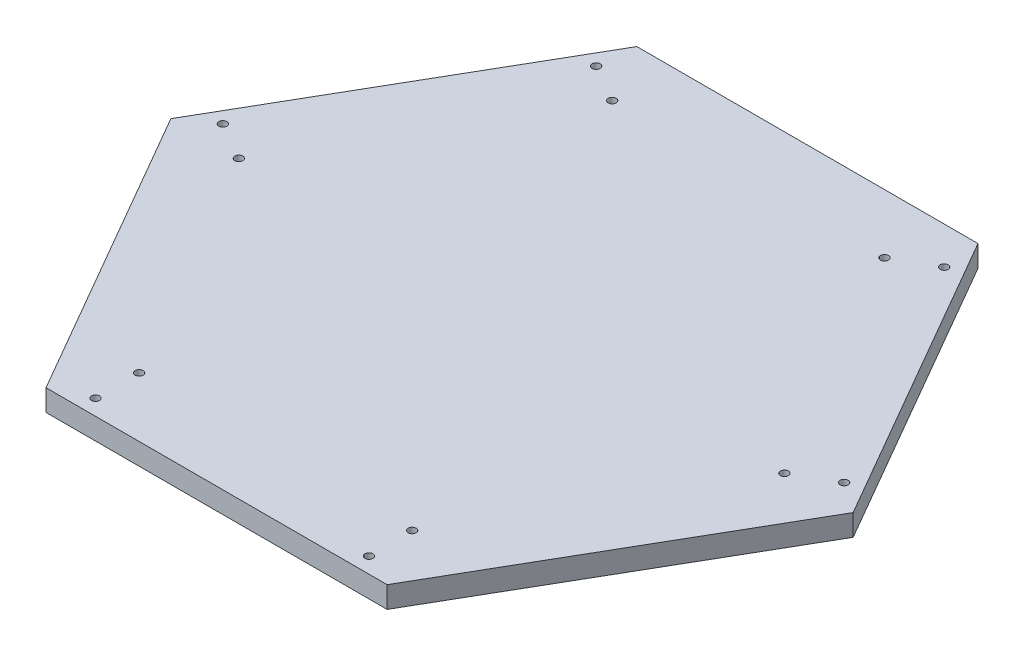
ISO-10303-21;
HEADER;
FILE_DESCRIPTION(('STEP AP214'),'2;1');
FILE_NAME('part.step','',(''),(''),'','','');
FILE_SCHEMA(('AUTOMOTIVE_DESIGN { 1 0 10303 214 1 1 1 1 }'));
ENDSEC;
DATA;
#1=APPLICATION_CONTEXT('core data for automotive mechanical design processes');
#2=APPLICATION_PROTOCOL_DEFINITION('international standard','automotive_design',2000,#1);
#3=PRODUCT_CONTEXT('',#1,'mechanical');
#4=PRODUCT('Part','Part','',(#3));
#5=PRODUCT_RELATED_PRODUCT_CATEGORY('part','',(#4));
#6=PRODUCT_DEFINITION_FORMATION('','',#4);
#7=PRODUCT_DEFINITION_CONTEXT('part definition',#1,'design');
#8=PRODUCT_DEFINITION('design','',#6,#7);
#9=PRODUCT_DEFINITION_SHAPE('','',#8);
#10=(LENGTH_UNIT() NAMED_UNIT(*) SI_UNIT(.MILLI.,.METRE.));
#11=(NAMED_UNIT(*) PLANE_ANGLE_UNIT() SI_UNIT($,.RADIAN.));
#12=(NAMED_UNIT(*) SI_UNIT($,.STERADIAN.) SOLID_ANGLE_UNIT());
#13=UNCERTAINTY_MEASURE_WITH_UNIT(LENGTH_MEASURE(1.E-05),#10,'distance_accuracy_value','');
#14=(GEOMETRIC_REPRESENTATION_CONTEXT(3) GLOBAL_UNCERTAINTY_ASSIGNED_CONTEXT((#13)) GLOBAL_UNIT_ASSIGNED_CONTEXT((#10,
#11,#12)) REPRESENTATION_CONTEXT('',''));
#15=CARTESIAN_POINT('',(0.,0.,0.));
#16=DIRECTION('',(0.,0.,1.));
#17=DIRECTION('',(1.,0.,0.));
#18=AXIS2_PLACEMENT_3D('',#15,#16,#17);
#19=CARTESIAN_POINT('',(30.4004149377593,8.,136.258330731158));
#20=DIRECTION('',(-0.866025403784439,0.,-0.5));
#21=DIRECTION('',(-0.5,0.,0.866025403784439));
#22=AXIS2_PLACEMENT_3D('',#19,#20,#21);
#23=PLANE('',#22);
#24=DIRECTION('',(0.5,0.,-0.866025403784439));
#25=VECTOR('',#24,1.);
#26=CARTESIAN_POINT('',(30.4004149377593,0.,136.258330731158));
#27=LINE('',#26,#25);
#28=CARTESIAN_POINT('',(30.4004149377593,0.,136.258330731158));
#29=VERTEX_POINT('',#28);
#30=CARTESIAN_POINT('',(94.0004149377593,0.,26.0998993697775));
#31=VERTEX_POINT('',#30);
#32=EDGE_CURVE('E117',#29,#31,#27,.T.);
#33=ORIENTED_EDGE('',*,*,#32,.T.);
#34=DIRECTION('',(0.,-1.,0.));
#35=VECTOR('',#34,1.);
#36=CARTESIAN_POINT('',(94.0004149377593,8.,26.0998993697775));
#37=LINE('',#36,#35);
#38=CARTESIAN_POINT('',(94.0004149377593,8.,26.0998993697775));
#39=VERTEX_POINT('',#38);
#40=EDGE_CURVE('E11',#39,#31,#37,.T.);
#41=ORIENTED_EDGE('',*,*,#40,.F.);
#42=DIRECTION('',(0.5,0.,-0.866025403784439));
#43=VECTOR('',#42,1.);
#44=CARTESIAN_POINT('',(30.4004149377593,8.,136.258330731158));
#45=LINE('',#44,#43);
#46=CARTESIAN_POINT('',(30.4004149377593,8.,136.258330731158));
#47=VERTEX_POINT('',#46);
#48=EDGE_CURVE('E128',#47,#39,#45,.T.);
#49=ORIENTED_EDGE('',*,*,#48,.F.);
#50=DIRECTION('',(0.,-1.,0.));
#51=VECTOR('',#50,1.);
#52=CARTESIAN_POINT('',(30.4004149377593,8.,136.258330731158));
#53=LINE('',#52,#51);
#54=EDGE_CURVE('E113',#47,#29,#53,.T.);
#55=ORIENTED_EDGE('',*,*,#54,.T.);
#56=EDGE_LOOP('',(#33,#41,#49,#55));
#57=FACE_BOUND('',#56,.T.);
#58=ADVANCED_FACE('F33',(#57),#23,.F.);
#59=CARTESIAN_POINT('',(94.0004149377593,8.,26.0998993697775));
#60=DIRECTION('',(-0.866025403784439,0.,0.5));
#61=DIRECTION('',(0.5,0.,0.866025403784439));
#62=AXIS2_PLACEMENT_3D('',#59,#60,#61);
#63=PLANE('',#62);
#64=DIRECTION('',(-0.5,0.,-0.866025403784438));
#65=VECTOR('',#64,1.);
#66=CARTESIAN_POINT('',(94.0004149377593,0.,26.0998993697775));
#67=LINE('',#66,#65);
#68=CARTESIAN_POINT('',(30.4004149377592,0.,-84.0585319916032));
#69=VERTEX_POINT('',#68);
#70=EDGE_CURVE('E120',#31,#69,#67,.T.);
#71=ORIENTED_EDGE('',*,*,#70,.T.);
#72=DIRECTION('',(0.,-1.,0.));
#73=VECTOR('',#72,1.);
#74=CARTESIAN_POINT('',(30.4004149377592,8.,-84.0585319916032));
#75=LINE('',#74,#73);
#76=CARTESIAN_POINT('',(30.4004149377592,8.,-84.0585319916032));
#77=VERTEX_POINT('',#76);
#78=EDGE_CURVE('E41',#77,#69,#75,.T.);
#79=ORIENTED_EDGE('',*,*,#78,.F.);
#80=DIRECTION('',(-0.5,0.,-0.866025403784438));
#81=VECTOR('',#80,1.);
#82=CARTESIAN_POINT('',(94.0004149377593,8.,26.0998993697775));
#83=LINE('',#82,#81);
#84=EDGE_CURVE('E86',#39,#77,#83,.T.);
#85=ORIENTED_EDGE('',*,*,#84,.F.);
#86=ORIENTED_EDGE('',*,*,#40,.T.);
#87=EDGE_LOOP('',(#71,#79,#85,#86));
#88=FACE_BOUND('',#87,.T.);
#89=ADVANCED_FACE('F153',(#88),#63,.F.);
#90=CARTESIAN_POINT('',(30.4004149377592,8.,-84.0585319916032));
#91=DIRECTION('',(0.,0.,1.));
#92=DIRECTION('',(1.,0.,0.));
#93=AXIS2_PLACEMENT_3D('',#90,#91,#92);
#94=PLANE('',#93);
#95=DIRECTION('',(-1.,0.,0.));
#96=VECTOR('',#95,1.);
#97=CARTESIAN_POINT('',(30.4004149377592,0.,-84.0585319916032));
#98=LINE('',#97,#96);
#99=CARTESIAN_POINT('',(-96.7995850622407,0.,-84.0585319916032));
#100=VERTEX_POINT('',#99);
#101=EDGE_CURVE('E123',#69,#100,#98,.T.);
#102=ORIENTED_EDGE('',*,*,#101,.T.);
#103=DIRECTION('',(0.,-1.,0.));
#104=VECTOR('',#103,1.);
#105=CARTESIAN_POINT('',(-96.7995850622407,8.,-84.0585319916032));
#106=LINE('',#105,#104);
#107=CARTESIAN_POINT('',(-96.7995850622407,8.,-84.0585319916032));
#108=VERTEX_POINT('',#107);
#109=EDGE_CURVE('E108',#108,#100,#106,.T.);
#110=ORIENTED_EDGE('',*,*,#109,.F.);
#111=DIRECTION('',(-1.,0.,0.));
#112=VECTOR('',#111,1.);
#113=CARTESIAN_POINT('',(30.4004149377592,8.,-84.0585319916032));
#114=LINE('',#113,#112);
#115=EDGE_CURVE('E99',#77,#108,#114,.T.);
#116=ORIENTED_EDGE('',*,*,#115,.F.);
#117=ORIENTED_EDGE('',*,*,#78,.T.);
#118=EDGE_LOOP('',(#102,#110,#116,#117));
#119=FACE_BOUND('',#118,.T.);
#120=ADVANCED_FACE('F134',(#119),#94,.F.);
#121=CARTESIAN_POINT('',(-96.7995850622407,8.,-84.0585319916032));
#122=DIRECTION('',(0.866025403784439,0.,0.5));
#123=DIRECTION('',(0.5,0.,-0.866025403784439));
#124=AXIS2_PLACEMENT_3D('',#121,#122,#123);
#125=PLANE('',#124);
#126=DIRECTION('',(-0.5,0.,0.866025403784439));
#127=VECTOR('',#126,1.);
#128=CARTESIAN_POINT('',(-96.7995850622407,0.,-84.0585319916032));
#129=LINE('',#128,#127);
#130=CARTESIAN_POINT('',(-160.399585062241,0.,26.0998993697775));
#131=VERTEX_POINT('',#130);
#132=EDGE_CURVE('E107',#100,#131,#129,.T.);
#133=ORIENTED_EDGE('',*,*,#132,.T.);
#134=DIRECTION('',(0.,-1.,0.));
#135=VECTOR('',#134,1.);
#136=CARTESIAN_POINT('',(-160.399585062241,8.,26.0998993697775));
#137=LINE('',#136,#135);
#138=CARTESIAN_POINT('',(-160.399585062241,8.,26.0998993697775));
#139=VERTEX_POINT('',#138);
#140=EDGE_CURVE('E104',#139,#131,#137,.T.);
#141=ORIENTED_EDGE('',*,*,#140,.F.);
#142=DIRECTION('',(-0.5,0.,0.866025403784439));
#143=VECTOR('',#142,1.);
#144=CARTESIAN_POINT('',(-96.7995850622407,8.,-84.0585319916032));
#145=LINE('',#144,#143);
#146=EDGE_CURVE('E93',#108,#139,#145,.T.);
#147=ORIENTED_EDGE('',*,*,#146,.F.);
#148=ORIENTED_EDGE('',*,*,#109,.T.);
#149=EDGE_LOOP('',(#133,#141,#147,#148));
#150=FACE_BOUND('',#149,.T.);
#151=ADVANCED_FACE('F105',(#150),#125,.F.);
#152=CARTESIAN_POINT('',(-160.399585062241,8.,26.0998993697775));
#153=DIRECTION('',(0.866025403784439,0.,-0.5));
#154=DIRECTION('',(-0.5,0.,-0.866025403784439));
#155=AXIS2_PLACEMENT_3D('',#152,#153,#154);
#156=PLANE('',#155);
#157=DIRECTION('',(0.5,0.,0.866025403784439));
#158=VECTOR('',#157,1.);
#159=CARTESIAN_POINT('',(-160.399585062241,0.,26.0998993697775));
#160=LINE('',#159,#158);
#161=CARTESIAN_POINT('',(-96.7995850622408,0.,136.258330731158));
#162=VERTEX_POINT('',#161);
#163=EDGE_CURVE('E72',#131,#162,#160,.T.);
#164=ORIENTED_EDGE('',*,*,#163,.T.);
#165=DIRECTION('',(0.,-1.,0.));
#166=VECTOR('',#165,1.);
#167=CARTESIAN_POINT('',(-96.7995850622408,8.,136.258330731158));
#168=LINE('',#167,#166);
#169=CARTESIAN_POINT('',(-96.7995850622408,8.,136.258330731158));
#170=VERTEX_POINT('',#169);
#171=EDGE_CURVE('E109',#170,#162,#168,.T.);
#172=ORIENTED_EDGE('',*,*,#171,.F.);
#173=DIRECTION('',(0.5,0.,0.866025403784439));
#174=VECTOR('',#173,1.);
#175=CARTESIAN_POINT('',(-160.399585062241,8.,26.0998993697775));
#176=LINE('',#175,#174);
#177=EDGE_CURVE('E97',#139,#170,#176,.T.);
#178=ORIENTED_EDGE('',*,*,#177,.F.);
#179=ORIENTED_EDGE('',*,*,#140,.T.);
#180=EDGE_LOOP('',(#164,#172,#178,#179));
#181=FACE_BOUND('',#180,.T.);
#182=ADVANCED_FACE('F111',(#181),#156,.F.);
#183=CARTESIAN_POINT('',(-96.7995850622408,8.,136.258330731158));
#184=DIRECTION('',(0.,0.,-1.));
#185=DIRECTION('',(-1.,0.,0.));
#186=AXIS2_PLACEMENT_3D('',#183,#184,#185);
#187=PLANE('',#186);
#188=DIRECTION('',(1.,0.,0.));
#189=VECTOR('',#188,1.);
#190=CARTESIAN_POINT('',(-96.7995850622408,0.,136.258330731158));
#191=LINE('',#190,#189);
#192=EDGE_CURVE('E78',#162,#29,#191,.T.);
#193=ORIENTED_EDGE('',*,*,#192,.T.);
#194=ORIENTED_EDGE('',*,*,#54,.F.);
#195=DIRECTION('',(1.,0.,0.));
#196=VECTOR('',#195,1.);
#197=CARTESIAN_POINT('',(-96.7995850622408,8.,136.258330731158));
#198=LINE('',#197,#196);
#199=EDGE_CURVE('E49',#170,#47,#198,.T.);
#200=ORIENTED_EDGE('',*,*,#199,.F.);
#201=ORIENTED_EDGE('',*,*,#171,.T.);
#202=EDGE_LOOP('',(#193,#194,#200,#201));
#203=FACE_BOUND('',#202,.T.);
#204=ADVANCED_FACE('F141',(#203),#187,.F.);
#205=CARTESIAN_POINT('',(0.,8.,0.));
#206=DIRECTION('',(0.,1.,0.));
#207=DIRECTION('',(0.,0.,1.));
#208=AXIS2_PLACEMENT_3D('',#205,#206,#207);
#209=PLANE('',#208);
#210=CARTESIAN_POINT('',(-134.907098596669,8.,26.245617600146));
#211=DIRECTION('',(0.,1.,0.));
#212=DIRECTION('',(0.,0.,1.));
#213=AXIS2_PLACEMENT_3D('',#210,#211,#212);
#214=CIRCLE('',#213,1.5);
#215=CARTESIAN_POINT('',(-134.907098596669,8.,27.745617600146));
#216=VERTEX_POINT('',#215);
#217=EDGE_CURVE('E319',#216,#216,#214,.T.);
#218=ORIENTED_EDGE('',*,*,#217,.F.);
#219=EDGE_LOOP('',(#218));
#220=FACE_BOUND('',#219,.T.);
#221=CARTESIAN_POINT('',(-149.023312678356,8.,18.095617600146));
#222=DIRECTION('',(0.,1.,0.));
#223=DIRECTION('',(0.,0.,1.));
#224=AXIS2_PLACEMENT_3D('',#221,#222,#223);
#225=CIRCLE('',#224,1.5);
#226=CARTESIAN_POINT('',(-149.023312678356,8.,19.595617600146));
#227=VERTEX_POINT('',#226);
#228=EDGE_CURVE('E321',#227,#227,#225,.T.);
#229=ORIENTED_EDGE('',*,*,#228,.F.);
#230=EDGE_LOOP('',(#229));
#231=FACE_BOUND('',#230,.T.);
#232=CARTESIAN_POINT('',(-83.9593150754635,8.,-61.9985319916032));
#233=DIRECTION('',(0.,1.,0.));
#234=DIRECTION('',(0.,0.,1.));
#235=AXIS2_PLACEMENT_3D('',#232,#233,#234);
#236=CIRCLE('',#235,1.5);
#237=CARTESIAN_POINT('',(-83.9593150754635,8.,-60.4985319916032));
#238=VERTEX_POINT('',#237);
#239=EDGE_CURVE('E327',#238,#238,#236,.T.);
#240=ORIENTED_EDGE('',*,*,#239,.F.);
#241=EDGE_LOOP('',(#240));
#242=FACE_BOUND('',#241,.T.);
#243=CARTESIAN_POINT('',(-98.0755291571498,8.,-70.1485319916032));
#244=DIRECTION('',(0.,1.,0.));
#245=DIRECTION('',(0.,0.,1.));
#246=AXIS2_PLACEMENT_3D('',#243,#244,#245);
#247=CIRCLE('',#246,1.5);
#248=CARTESIAN_POINT('',(-98.0755291571498,8.,-68.6485319916032));
#249=VERTEX_POINT('',#248);
#250=EDGE_CURVE('E333',#249,#249,#247,.T.);
#251=ORIENTED_EDGE('',*,*,#250,.F.);
#252=EDGE_LOOP('',(#251));
#253=FACE_BOUND('',#252,.T.);
#254=CARTESIAN_POINT('',(17.560144950982,8.,-61.9985319916032));
#255=DIRECTION('',(0.,1.,0.));
#256=DIRECTION('',(0.,0.,1.));
#257=AXIS2_PLACEMENT_3D('',#254,#255,#256);
#258=CIRCLE('',#257,1.5);
#259=CARTESIAN_POINT('',(17.560144950982,8.,-60.4985319916032));
#260=VERTEX_POINT('',#259);
#261=EDGE_CURVE('E339',#260,#260,#258,.T.);
#262=ORIENTED_EDGE('',*,*,#261,.F.);
#263=EDGE_LOOP('',(#262));
#264=FACE_BOUND('',#263,.T.);
#265=CARTESIAN_POINT('',(31.6763590326683,8.,-70.1485319916032));
#266=DIRECTION('',(0.,1.,0.));
#267=DIRECTION('',(0.,0.,1.));
#268=AXIS2_PLACEMENT_3D('',#265,#266,#267);
#269=CIRCLE('',#268,1.5);
#270=CARTESIAN_POINT('',(31.6763590326683,8.,-68.6485319916032));
#271=VERTEX_POINT('',#270);
#272=EDGE_CURVE('E345',#271,#271,#269,.T.);
#273=ORIENTED_EDGE('',*,*,#272,.F.);
#274=EDGE_LOOP('',(#273));
#275=FACE_BOUND('',#274,.T.);
#276=CARTESIAN_POINT('',(68.5079284721879,8.,26.2456176001459));
#277=DIRECTION('',(0.,1.,0.));
#278=DIRECTION('',(0.,0.,1.));
#279=AXIS2_PLACEMENT_3D('',#276,#277,#278);
#280=CIRCLE('',#279,1.5);
#281=CARTESIAN_POINT('',(68.5079284721879,8.,27.7456176001459));
#282=VERTEX_POINT('',#281);
#283=EDGE_CURVE('E351',#282,#282,#280,.T.);
#284=ORIENTED_EDGE('',*,*,#283,.F.);
#285=EDGE_LOOP('',(#284));
#286=FACE_BOUND('',#285,.T.);
#287=CARTESIAN_POINT('',(82.6241425538743,8.,18.0956176001459));
#288=DIRECTION('',(0.,1.,0.));
#289=DIRECTION('',(0.,0.,1.));
#290=AXIS2_PLACEMENT_3D('',#287,#288,#289);
#291=CIRCLE('',#290,1.5);
#292=CARTESIAN_POINT('',(82.6241425538743,8.,19.5956176001459));
#293=VERTEX_POINT('',#292);
#294=EDGE_CURVE('E357',#293,#293,#291,.T.);
#295=ORIENTED_EDGE('',*,*,#294,.F.);
#296=EDGE_LOOP('',(#295));
#297=FACE_BOUND('',#296,.T.);
#298=CARTESIAN_POINT('',(17.5666844838748,8.,114.109731416683));
#299=DIRECTION('',(0.,1.,0.));
#300=DIRECTION('',(0.,0.,1.));
#301=AXIS2_PLACEMENT_3D('',#298,#299,#300);
#302=CIRCLE('',#301,1.5);
#303=CARTESIAN_POINT('',(17.5666844838748,8.,115.609731416683));
#304=VERTEX_POINT('',#303);
#305=EDGE_CURVE('E363',#304,#304,#302,.T.);
#306=ORIENTED_EDGE('',*,*,#305,.F.);
#307=EDGE_LOOP('',(#306));
#308=FACE_BOUND('',#307,.T.);
#309=CARTESIAN_POINT('',(-84.2214168648321,8.,114.108384531236));
#310=DIRECTION('',(0.,1.,0.));
#311=DIRECTION('',(0.,0.,1.));
#312=AXIS2_PLACEMENT_3D('',#309,#310,#311);
#313=CIRCLE('',#312,1.5);
#314=CARTESIAN_POINT('',(-84.2214168648321,8.,115.608384531236));
#315=VERTEX_POINT('',#314);
#316=EDGE_CURVE('E369',#315,#315,#313,.T.);
#317=ORIENTED_EDGE('',*,*,#316,.F.);
#318=EDGE_LOOP('',(#317));
#319=FACE_BOUND('',#318,.T.);
#320=CARTESIAN_POINT('',(-84.1795375187487,8.,130.408330731158));
#321=DIRECTION('',(0.,1.,0.));
#322=DIRECTION('',(0.,0.,1.));
#323=AXIS2_PLACEMENT_3D('',#320,#321,#322);
#324=CIRCLE('',#323,1.5);
#325=CARTESIAN_POINT('',(-84.1795375187487,8.,131.908330731158));
#326=VERTEX_POINT('',#325);
#327=EDGE_CURVE('E375',#326,#326,#324,.T.);
#328=ORIENTED_EDGE('',*,*,#327,.F.);
#329=EDGE_LOOP('',(#328));
#330=FACE_BOUND('',#329,.T.);
#331=CARTESIAN_POINT('',(17.7803673942672,8.,130.408330731158));
#332=DIRECTION('',(0.,1.,0.));
#333=DIRECTION('',(0.,0.,1.));
#334=AXIS2_PLACEMENT_3D('',#331,#332,#333);
#335=CIRCLE('',#334,1.5);
#336=CARTESIAN_POINT('',(17.7803673942672,8.,131.908330731158));
#337=VERTEX_POINT('',#336);
#338=EDGE_CURVE('E381',#337,#337,#335,.T.);
#339=ORIENTED_EDGE('',*,*,#338,.F.);
#340=EDGE_LOOP('',(#339));
#341=FACE_BOUND('',#340,.T.);
#342=ORIENTED_EDGE('',*,*,#48,.T.);
#343=ORIENTED_EDGE('',*,*,#84,.T.);
#344=ORIENTED_EDGE('',*,*,#115,.T.);
#345=ORIENTED_EDGE('',*,*,#146,.T.);
#346=ORIENTED_EDGE('',*,*,#177,.T.);
#347=ORIENTED_EDGE('',*,*,#199,.T.);
#348=EDGE_LOOP('',(#342,#343,#344,#345,#346,#347));
#349=FACE_BOUND('',#348,.T.);
#350=ADVANCED_FACE('F95',(#220,#231,#242,#253,#264,#275,#286,#297,#308,#319,#330,#341,#349),
#209,.T.);
#351=CARTESIAN_POINT('',(0.,0.,0.));
#352=DIRECTION('',(0.,1.,0.));
#353=DIRECTION('',(0.,0.,1.));
#354=AXIS2_PLACEMENT_3D('',#351,#352,#353);
#355=PLANE('',#354);
#356=CARTESIAN_POINT('',(-134.907098596669,0.,26.245617600146));
#357=DIRECTION('',(0.,1.,0.));
#358=DIRECTION('',(0.,0.,1.));
#359=AXIS2_PLACEMENT_3D('',#356,#357,#358);
#360=CIRCLE('',#359,1.5);
#361=CARTESIAN_POINT('',(-134.907098596669,0.,27.745617600146));
#362=VERTEX_POINT('',#361);
#363=EDGE_CURVE('E316',#362,#362,#360,.T.);
#364=ORIENTED_EDGE('',*,*,#363,.T.);
#365=EDGE_LOOP('',(#364));
#366=FACE_BOUND('',#365,.T.);
#367=CARTESIAN_POINT('',(-149.023312678356,0.,18.095617600146));
#368=DIRECTION('',(0.,1.,0.));
#369=DIRECTION('',(0.,0.,1.));
#370=AXIS2_PLACEMENT_3D('',#367,#368,#369);
#371=CIRCLE('',#370,1.5);
#372=CARTESIAN_POINT('',(-149.023312678356,0.,19.595617600146));
#373=VERTEX_POINT('',#372);
#374=EDGE_CURVE('E324',#373,#373,#371,.T.);
#375=ORIENTED_EDGE('',*,*,#374,.T.);
#376=EDGE_LOOP('',(#375));
#377=FACE_BOUND('',#376,.T.);
#378=CARTESIAN_POINT('',(-83.9593150754635,0.,-61.9985319916032));
#379=DIRECTION('',(0.,1.,0.));
#380=DIRECTION('',(0.,0.,1.));
#381=AXIS2_PLACEMENT_3D('',#378,#379,#380);
#382=CIRCLE('',#381,1.5);
#383=CARTESIAN_POINT('',(-83.9593150754635,0.,-60.4985319916032));
#384=VERTEX_POINT('',#383);
#385=EDGE_CURVE('E330',#384,#384,#382,.T.);
#386=ORIENTED_EDGE('',*,*,#385,.T.);
#387=EDGE_LOOP('',(#386));
#388=FACE_BOUND('',#387,.T.);
#389=CARTESIAN_POINT('',(-98.0755291571498,0.,-70.1485319916032));
#390=DIRECTION('',(0.,1.,0.));
#391=DIRECTION('',(0.,0.,1.));
#392=AXIS2_PLACEMENT_3D('',#389,#390,#391);
#393=CIRCLE('',#392,1.5);
#394=CARTESIAN_POINT('',(-98.0755291571498,0.,-68.6485319916032));
#395=VERTEX_POINT('',#394);
#396=EDGE_CURVE('E336',#395,#395,#393,.T.);
#397=ORIENTED_EDGE('',*,*,#396,.T.);
#398=EDGE_LOOP('',(#397));
#399=FACE_BOUND('',#398,.T.);
#400=CARTESIAN_POINT('',(17.560144950982,0.,-61.9985319916032));
#401=DIRECTION('',(0.,1.,0.));
#402=DIRECTION('',(0.,0.,1.));
#403=AXIS2_PLACEMENT_3D('',#400,#401,#402);
#404=CIRCLE('',#403,1.5);
#405=CARTESIAN_POINT('',(17.560144950982,0.,-60.4985319916032));
#406=VERTEX_POINT('',#405);
#407=EDGE_CURVE('E342',#406,#406,#404,.T.);
#408=ORIENTED_EDGE('',*,*,#407,.T.);
#409=EDGE_LOOP('',(#408));
#410=FACE_BOUND('',#409,.T.);
#411=CARTESIAN_POINT('',(31.6763590326683,0.,-70.1485319916032));
#412=DIRECTION('',(0.,1.,0.));
#413=DIRECTION('',(0.,0.,1.));
#414=AXIS2_PLACEMENT_3D('',#411,#412,#413);
#415=CIRCLE('',#414,1.5);
#416=CARTESIAN_POINT('',(31.6763590326683,0.,-68.6485319916032));
#417=VERTEX_POINT('',#416);
#418=EDGE_CURVE('E348',#417,#417,#415,.T.);
#419=ORIENTED_EDGE('',*,*,#418,.T.);
#420=EDGE_LOOP('',(#419));
#421=FACE_BOUND('',#420,.T.);
#422=CARTESIAN_POINT('',(68.5079284721879,0.,26.2456176001459));
#423=DIRECTION('',(0.,1.,0.));
#424=DIRECTION('',(0.,0.,1.));
#425=AXIS2_PLACEMENT_3D('',#422,#423,#424);
#426=CIRCLE('',#425,1.5);
#427=CARTESIAN_POINT('',(68.5079284721879,0.,27.7456176001459));
#428=VERTEX_POINT('',#427);
#429=EDGE_CURVE('E354',#428,#428,#426,.T.);
#430=ORIENTED_EDGE('',*,*,#429,.T.);
#431=EDGE_LOOP('',(#430));
#432=FACE_BOUND('',#431,.T.);
#433=CARTESIAN_POINT('',(82.6241425538743,0.,18.0956176001459));
#434=DIRECTION('',(0.,1.,0.));
#435=DIRECTION('',(0.,0.,1.));
#436=AXIS2_PLACEMENT_3D('',#433,#434,#435);
#437=CIRCLE('',#436,1.5);
#438=CARTESIAN_POINT('',(82.6241425538743,0.,19.5956176001459));
#439=VERTEX_POINT('',#438);
#440=EDGE_CURVE('E360',#439,#439,#437,.T.);
#441=ORIENTED_EDGE('',*,*,#440,.T.);
#442=EDGE_LOOP('',(#441));
#443=FACE_BOUND('',#442,.T.);
#444=CARTESIAN_POINT('',(17.5666844838748,0.,114.109731416683));
#445=DIRECTION('',(0.,1.,0.));
#446=DIRECTION('',(0.,0.,1.));
#447=AXIS2_PLACEMENT_3D('',#444,#445,#446);
#448=CIRCLE('',#447,1.5);
#449=CARTESIAN_POINT('',(17.5666844838748,0.,115.609731416683));
#450=VERTEX_POINT('',#449);
#451=EDGE_CURVE('E366',#450,#450,#448,.T.);
#452=ORIENTED_EDGE('',*,*,#451,.T.);
#453=EDGE_LOOP('',(#452));
#454=FACE_BOUND('',#453,.T.);
#455=CARTESIAN_POINT('',(-84.2214168648321,0.,114.108384531236));
#456=DIRECTION('',(0.,1.,0.));
#457=DIRECTION('',(0.,0.,1.));
#458=AXIS2_PLACEMENT_3D('',#455,#456,#457);
#459=CIRCLE('',#458,1.5);
#460=CARTESIAN_POINT('',(-84.2214168648321,0.,115.608384531236));
#461=VERTEX_POINT('',#460);
#462=EDGE_CURVE('E372',#461,#461,#459,.T.);
#463=ORIENTED_EDGE('',*,*,#462,.T.);
#464=EDGE_LOOP('',(#463));
#465=FACE_BOUND('',#464,.T.);
#466=CARTESIAN_POINT('',(-84.1795375187487,0.,130.408330731158));
#467=DIRECTION('',(0.,1.,0.));
#468=DIRECTION('',(0.,0.,1.));
#469=AXIS2_PLACEMENT_3D('',#466,#467,#468);
#470=CIRCLE('',#469,1.5);
#471=CARTESIAN_POINT('',(-84.1795375187487,0.,131.908330731158));
#472=VERTEX_POINT('',#471);
#473=EDGE_CURVE('E378',#472,#472,#470,.T.);
#474=ORIENTED_EDGE('',*,*,#473,.T.);
#475=EDGE_LOOP('',(#474));
#476=FACE_BOUND('',#475,.T.);
#477=CARTESIAN_POINT('',(17.7803673942672,0.,130.408330731158));
#478=DIRECTION('',(0.,1.,0.));
#479=DIRECTION('',(0.,0.,1.));
#480=AXIS2_PLACEMENT_3D('',#477,#478,#479);
#481=CIRCLE('',#480,1.5);
#482=CARTESIAN_POINT('',(17.7803673942672,0.,131.908330731158));
#483=VERTEX_POINT('',#482);
#484=EDGE_CURVE('E121',#483,#483,#481,.T.);
#485=ORIENTED_EDGE('',*,*,#484,.T.);
#486=EDGE_LOOP('',(#485));
#487=FACE_BOUND('',#486,.T.);
#488=ORIENTED_EDGE('',*,*,#32,.F.);
#489=ORIENTED_EDGE('',*,*,#192,.F.);
#490=ORIENTED_EDGE('',*,*,#163,.F.);
#491=ORIENTED_EDGE('',*,*,#132,.F.);
#492=ORIENTED_EDGE('',*,*,#101,.F.);
#493=ORIENTED_EDGE('',*,*,#70,.F.);
#494=EDGE_LOOP('',(#488,#489,#490,#491,#492,#493));
#495=FACE_BOUND('',#494,.T.);
#496=ADVANCED_FACE('F137',(#366,#377,#388,#399,#410,#421,#432,#443,#454,#465,#476,#487,#495),
#355,.F.);
#497=CARTESIAN_POINT('',(17.7803673942672,0.,130.408330731158));
#498=DIRECTION('',(0.,1.,0.));
#499=DIRECTION('',(0.,0.,1.));
#500=AXIS2_PLACEMENT_3D('',#497,#498,#499);
#501=CYLINDRICAL_SURFACE('',#500,1.5);
#502=ORIENTED_EDGE('',*,*,#484,.F.);
#503=EDGE_LOOP('',(#502));
#504=FACE_BOUND('',#503,.T.);
#505=ORIENTED_EDGE('',*,*,#338,.T.);
#506=EDGE_LOOP('',(#505));
#507=FACE_BOUND('',#506,.T.);
#508=ADVANCED_FACE('F190',(#504,#507),#501,.F.);
#509=CARTESIAN_POINT('',(-84.1795375187487,0.,130.408330731158));
#510=DIRECTION('',(0.,1.,0.));
#511=DIRECTION('',(0.,0.,1.));
#512=AXIS2_PLACEMENT_3D('',#509,#510,#511);
#513=CYLINDRICAL_SURFACE('',#512,1.5);
#514=ORIENTED_EDGE('',*,*,#473,.F.);
#515=EDGE_LOOP('',(#514));
#516=FACE_BOUND('',#515,.T.);
#517=ORIENTED_EDGE('',*,*,#327,.T.);
#518=EDGE_LOOP('',(#517));
#519=FACE_BOUND('',#518,.T.);
#520=ADVANCED_FACE('F199',(#516,#519),#513,.F.);
#521=CARTESIAN_POINT('',(-84.2214168648321,0.,114.108384531236));
#522=DIRECTION('',(0.,1.,0.));
#523=DIRECTION('',(0.,0.,1.));
#524=AXIS2_PLACEMENT_3D('',#521,#522,#523);
#525=CYLINDRICAL_SURFACE('',#524,1.5);
#526=ORIENTED_EDGE('',*,*,#462,.F.);
#527=EDGE_LOOP('',(#526));
#528=FACE_BOUND('',#527,.T.);
#529=ORIENTED_EDGE('',*,*,#316,.T.);
#530=EDGE_LOOP('',(#529));
#531=FACE_BOUND('',#530,.T.);
#532=ADVANCED_FACE('F209',(#528,#531),#525,.F.);
#533=CARTESIAN_POINT('',(17.5666844838748,0.,114.109731416683));
#534=DIRECTION('',(0.,1.,0.));
#535=DIRECTION('',(0.,0.,1.));
#536=AXIS2_PLACEMENT_3D('',#533,#534,#535);
#537=CYLINDRICAL_SURFACE('',#536,1.5);
#538=ORIENTED_EDGE('',*,*,#451,.F.);
#539=EDGE_LOOP('',(#538));
#540=FACE_BOUND('',#539,.T.);
#541=ORIENTED_EDGE('',*,*,#305,.T.);
#542=EDGE_LOOP('',(#541));
#543=FACE_BOUND('',#542,.T.);
#544=ADVANCED_FACE('F219',(#540,#543),#537,.F.);
#545=CARTESIAN_POINT('',(82.6241425538743,0.,18.0956176001459));
#546=DIRECTION('',(0.,1.,0.));
#547=DIRECTION('',(0.,0.,1.));
#548=AXIS2_PLACEMENT_3D('',#545,#546,#547);
#549=CYLINDRICAL_SURFACE('',#548,1.5);
#550=ORIENTED_EDGE('',*,*,#440,.F.);
#551=EDGE_LOOP('',(#550));
#552=FACE_BOUND('',#551,.T.);
#553=ORIENTED_EDGE('',*,*,#294,.T.);
#554=EDGE_LOOP('',(#553));
#555=FACE_BOUND('',#554,.T.);
#556=ADVANCED_FACE('F229',(#552,#555),#549,.F.);
#557=CARTESIAN_POINT('',(68.5079284721879,0.,26.2456176001459));
#558=DIRECTION('',(0.,1.,0.));
#559=DIRECTION('',(0.,0.,1.));
#560=AXIS2_PLACEMENT_3D('',#557,#558,#559);
#561=CYLINDRICAL_SURFACE('',#560,1.5);
#562=ORIENTED_EDGE('',*,*,#429,.F.);
#563=EDGE_LOOP('',(#562));
#564=FACE_BOUND('',#563,.T.);
#565=ORIENTED_EDGE('',*,*,#283,.T.);
#566=EDGE_LOOP('',(#565));
#567=FACE_BOUND('',#566,.T.);
#568=ADVANCED_FACE('F239',(#564,#567),#561,.F.);
#569=CARTESIAN_POINT('',(31.6763590326683,0.,-70.1485319916032));
#570=DIRECTION('',(0.,1.,0.));
#571=DIRECTION('',(0.,0.,1.));
#572=AXIS2_PLACEMENT_3D('',#569,#570,#571);
#573=CYLINDRICAL_SURFACE('',#572,1.5);
#574=ORIENTED_EDGE('',*,*,#418,.F.);
#575=EDGE_LOOP('',(#574));
#576=FACE_BOUND('',#575,.T.);
#577=ORIENTED_EDGE('',*,*,#272,.T.);
#578=EDGE_LOOP('',(#577));
#579=FACE_BOUND('',#578,.T.);
#580=ADVANCED_FACE('F249',(#576,#579),#573,.F.);
#581=CARTESIAN_POINT('',(17.560144950982,0.,-61.9985319916032));
#582=DIRECTION('',(0.,1.,0.));
#583=DIRECTION('',(0.,0.,1.));
#584=AXIS2_PLACEMENT_3D('',#581,#582,#583);
#585=CYLINDRICAL_SURFACE('',#584,1.5);
#586=ORIENTED_EDGE('',*,*,#407,.F.);
#587=EDGE_LOOP('',(#586));
#588=FACE_BOUND('',#587,.T.);
#589=ORIENTED_EDGE('',*,*,#261,.T.);
#590=EDGE_LOOP('',(#589));
#591=FACE_BOUND('',#590,.T.);
#592=ADVANCED_FACE('F259',(#588,#591),#585,.F.);
#593=CARTESIAN_POINT('',(-98.0755291571498,0.,-70.1485319916032));
#594=DIRECTION('',(0.,1.,0.));
#595=DIRECTION('',(0.,0.,1.));
#596=AXIS2_PLACEMENT_3D('',#593,#594,#595);
#597=CYLINDRICAL_SURFACE('',#596,1.5);
#598=ORIENTED_EDGE('',*,*,#396,.F.);
#599=EDGE_LOOP('',(#598));
#600=FACE_BOUND('',#599,.T.);
#601=ORIENTED_EDGE('',*,*,#250,.T.);
#602=EDGE_LOOP('',(#601));
#603=FACE_BOUND('',#602,.T.);
#604=ADVANCED_FACE('F269',(#600,#603),#597,.F.);
#605=CARTESIAN_POINT('',(-83.9593150754635,0.,-61.9985319916032));
#606=DIRECTION('',(0.,1.,0.));
#607=DIRECTION('',(0.,0.,1.));
#608=AXIS2_PLACEMENT_3D('',#605,#606,#607);
#609=CYLINDRICAL_SURFACE('',#608,1.5);
#610=ORIENTED_EDGE('',*,*,#385,.F.);
#611=EDGE_LOOP('',(#610));
#612=FACE_BOUND('',#611,.T.);
#613=ORIENTED_EDGE('',*,*,#239,.T.);
#614=EDGE_LOOP('',(#613));
#615=FACE_BOUND('',#614,.T.);
#616=ADVANCED_FACE('F279',(#612,#615),#609,.F.);
#617=CARTESIAN_POINT('',(-149.023312678356,0.,18.095617600146));
#618=DIRECTION('',(0.,1.,0.));
#619=DIRECTION('',(0.,0.,1.));
#620=AXIS2_PLACEMENT_3D('',#617,#618,#619);
#621=CYLINDRICAL_SURFACE('',#620,1.5);
#622=ORIENTED_EDGE('',*,*,#374,.F.);
#623=EDGE_LOOP('',(#622));
#624=FACE_BOUND('',#623,.T.);
#625=ORIENTED_EDGE('',*,*,#228,.T.);
#626=EDGE_LOOP('',(#625));
#627=FACE_BOUND('',#626,.T.);
#628=ADVANCED_FACE('F289',(#624,#627),#621,.F.);
#629=CARTESIAN_POINT('',(-134.907098596669,0.,26.245617600146));
#630=DIRECTION('',(0.,1.,0.));
#631=DIRECTION('',(0.,0.,1.));
#632=AXIS2_PLACEMENT_3D('',#629,#630,#631);
#633=CYLINDRICAL_SURFACE('',#632,1.5);
#634=ORIENTED_EDGE('',*,*,#363,.F.);
#635=EDGE_LOOP('',(#634));
#636=FACE_BOUND('',#635,.T.);
#637=ORIENTED_EDGE('',*,*,#217,.T.);
#638=EDGE_LOOP('',(#637));
#639=FACE_BOUND('',#638,.T.);
#640=ADVANCED_FACE('F299',(#636,#639),#633,.F.);
#641=CLOSED_SHELL('',(#58,#89,#120,#151,#182,#204,#350,#496,#508,#520,#532,#544,#556,#568,#580,
#592,#604,#616,#628,#640));
#642=MANIFOLD_SOLID_BREP('B2',#641);
#643=ADVANCED_BREP_SHAPE_REPRESENTATION('',(#18,#642),#14);
#644=SHAPE_DEFINITION_REPRESENTATION(#9,#643);
ENDSEC;
END-ISO-10303-21;
